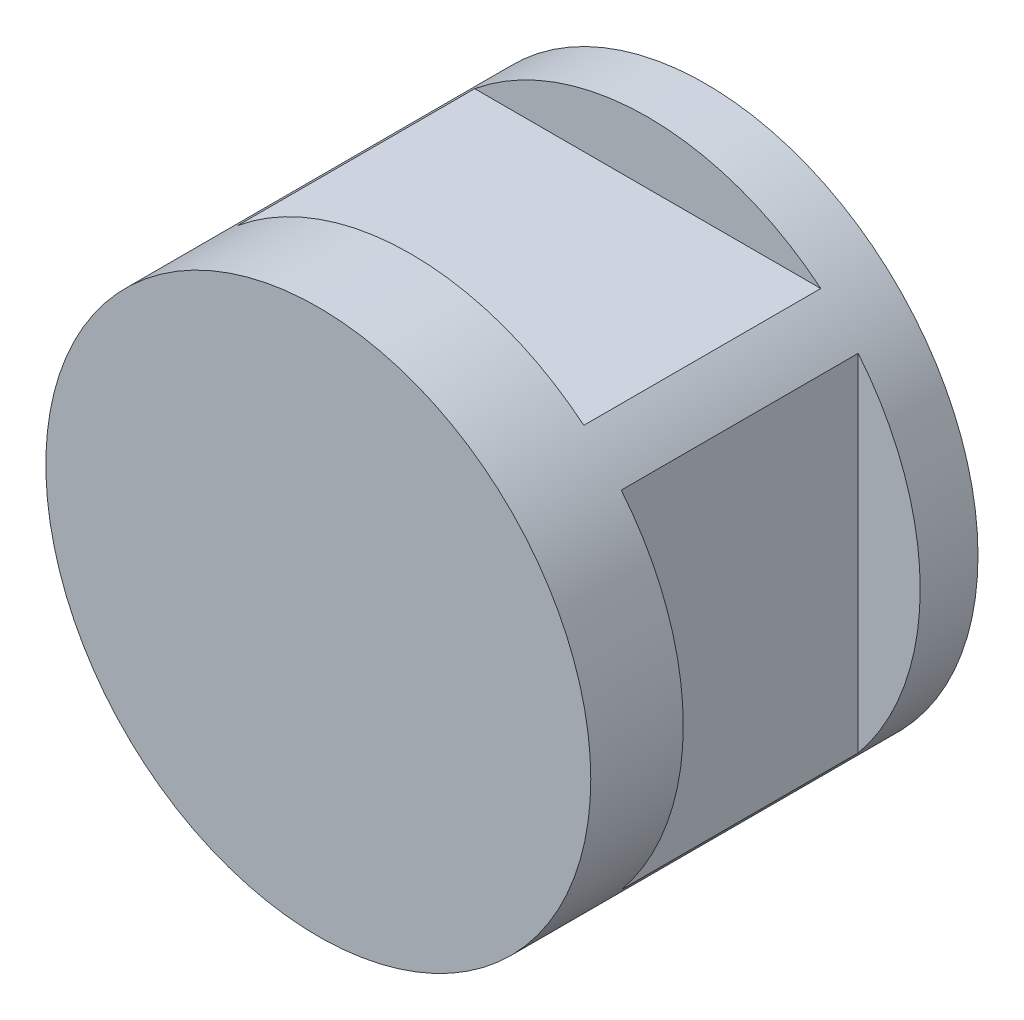
ISO-10303-21;
HEADER;
FILE_DESCRIPTION(('STEP AP214'),'2;1');
FILE_NAME('part.step','',(''),(''),'','','');
FILE_SCHEMA(('AUTOMOTIVE_DESIGN { 1 0 10303 214 1 1 1 1 }'));
ENDSEC;
DATA;
#1=APPLICATION_CONTEXT('core data for automotive mechanical design processes');
#2=APPLICATION_PROTOCOL_DEFINITION('international standard','automotive_design',2000,#1);
#3=PRODUCT_CONTEXT('',#1,'mechanical');
#4=PRODUCT('Part','Part','',(#3));
#5=PRODUCT_RELATED_PRODUCT_CATEGORY('part','',(#4));
#6=PRODUCT_DEFINITION_FORMATION('','',#4);
#7=PRODUCT_DEFINITION_CONTEXT('part definition',#1,'design');
#8=PRODUCT_DEFINITION('design','',#6,#7);
#9=PRODUCT_DEFINITION_SHAPE('','',#8);
#10=(LENGTH_UNIT() NAMED_UNIT(*) SI_UNIT(.MILLI.,.METRE.));
#11=(NAMED_UNIT(*) PLANE_ANGLE_UNIT() SI_UNIT($,.RADIAN.));
#12=(NAMED_UNIT(*) SI_UNIT($,.STERADIAN.) SOLID_ANGLE_UNIT());
#13=UNCERTAINTY_MEASURE_WITH_UNIT(LENGTH_MEASURE(1.E-05),#10,'distance_accuracy_value','');
#14=(GEOMETRIC_REPRESENTATION_CONTEXT(3) GLOBAL_UNCERTAINTY_ASSIGNED_CONTEXT((#13)) GLOBAL_UNIT_ASSIGNED_CONTEXT((#10,
#11,#12)) REPRESENTATION_CONTEXT('',''));
#15=CARTESIAN_POINT('',(0.,0.,0.));
#16=DIRECTION('',(0.,0.,1.));
#17=DIRECTION('',(1.,0.,0.));
#18=AXIS2_PLACEMENT_3D('',#15,#16,#17);
#19=CARTESIAN_POINT('',(0.,0.,-4.064));
#20=DIRECTION('',(0.,0.,1.));
#21=DIRECTION('',(1.,0.,0.));
#22=AXIS2_PLACEMENT_3D('',#19,#20,#21);
#23=PLANE('',#22);
#24=DIRECTION('',(-1.,0.,0.));
#25=VECTOR('',#24,1.);
#26=CARTESIAN_POINT('',(0.,-9.250000032,-4.064));
#27=LINE('',#26,#25);
#28=CARTESIAN_POINT('',(7.60513807727381,-9.250000032,-4.064));
#29=VERTEX_POINT('',#28);
#30=CARTESIAN_POINT('',(-7.60513807727381,-9.250000032,-4.064));
#31=VERTEX_POINT('',#30);
#32=EDGE_CURVE('E63',#29,#31,#27,.T.);
#33=ORIENTED_EDGE('',*,*,#32,.F.);
#34=CARTESIAN_POINT('',(0.,0.,-4.064));
#35=DIRECTION('',(0.,0.,1.));
#36=DIRECTION('',(1.,0.,0.));
#37=AXIS2_PLACEMENT_3D('',#34,#35,#36);
#38=CIRCLE('',#37,11.975000032);
#39=EDGE_CURVE('E167',#31,#29,#38,.T.);
#40=ORIENTED_EDGE('',*,*,#39,.F.);
#41=EDGE_LOOP('',(#33,#40));
#42=FACE_BOUND('',#41,.T.);
#43=ADVANCED_FACE('F41',(#42),#23,.F.);
#44=DIRECTION('',(0.,-1.,0.));
#45=VECTOR('',#44,1.);
#46=CARTESIAN_POINT('',(9.250000032,0.,-4.064));
#47=LINE('',#46,#45);
#48=CARTESIAN_POINT('',(9.250000032,7.60513807727381,-4.064));
#49=VERTEX_POINT('',#48);
#50=CARTESIAN_POINT('',(9.250000032,-7.60513807727381,-4.064));
#51=VERTEX_POINT('',#50);
#52=EDGE_CURVE('E146',#49,#51,#47,.T.);
#53=ORIENTED_EDGE('',*,*,#52,.F.);
#54=EDGE_CURVE('E51',#51,#49,#38,.T.);
#55=ORIENTED_EDGE('',*,*,#54,.F.);
#56=EDGE_LOOP('',(#53,#55));
#57=FACE_BOUND('',#56,.T.);
#58=ADVANCED_FACE('F191',(#57),#23,.F.);
#59=DIRECTION('',(1.,0.,0.));
#60=VECTOR('',#59,1.);
#61=CARTESIAN_POINT('',(0.,9.250000032,-4.064));
#62=LINE('',#61,#60);
#63=CARTESIAN_POINT('',(-7.60513807727381,9.250000032,-4.064));
#64=VERTEX_POINT('',#63);
#65=CARTESIAN_POINT('',(7.60513807727381,9.250000032,-4.064));
#66=VERTEX_POINT('',#65);
#67=EDGE_CURVE('E143',#64,#66,#62,.T.);
#68=ORIENTED_EDGE('',*,*,#67,.F.);
#69=EDGE_CURVE('E11',#66,#64,#38,.T.);
#70=ORIENTED_EDGE('',*,*,#69,.F.);
#71=EDGE_LOOP('',(#68,#70));
#72=FACE_BOUND('',#71,.T.);
#73=ADVANCED_FACE('F189',(#72),#23,.F.);
#74=DIRECTION('',(0.,1.,0.));
#75=VECTOR('',#74,1.);
#76=CARTESIAN_POINT('',(-9.250000032,0.,-4.064));
#77=LINE('',#76,#75);
#78=CARTESIAN_POINT('',(-9.250000032,-7.60513807727381,-4.064));
#79=VERTEX_POINT('',#78);
#80=CARTESIAN_POINT('',(-9.250000032,7.60513807727381,-4.064));
#81=VERTEX_POINT('',#80);
#82=EDGE_CURVE('E140',#79,#81,#77,.T.);
#83=ORIENTED_EDGE('',*,*,#82,.F.);
#84=EDGE_CURVE('E50',#81,#79,#38,.T.);
#85=ORIENTED_EDGE('',*,*,#84,.F.);
#86=EDGE_LOOP('',(#83,#85));
#87=FACE_BOUND('',#86,.T.);
#88=ADVANCED_FACE('F175',(#87),#23,.F.);
#89=CARTESIAN_POINT('',(0.,0.,-4.064));
#90=DIRECTION('',(0.,0.,1.));
#91=DIRECTION('',(1.,0.,0.));
#92=AXIS2_PLACEMENT_3D('',#89,#90,#91);
#93=CYLINDRICAL_SURFACE('',#92,11.975000032);
#94=DIRECTION('',(0.,0.,1.));
#95=VECTOR('',#94,1.);
#96=CARTESIAN_POINT('',(-9.250000032,-7.60513807727381,-14.478));
#97=LINE('',#96,#95);
#98=CARTESIAN_POINT('',(-9.250000032,-7.60513807727381,-14.478));
#99=VERTEX_POINT('',#98);
#100=EDGE_CURVE('E165',#99,#79,#97,.T.);
#101=ORIENTED_EDGE('',*,*,#100,.F.);
#102=CARTESIAN_POINT('',(0.,0.,-14.478));
#103=DIRECTION('',(0.,0.,-1.));
#104=DIRECTION('',(-1.,0.,0.));
#105=AXIS2_PLACEMENT_3D('',#102,#103,#104);
#106=CIRCLE('',#105,11.975000032);
#107=CARTESIAN_POINT('',(-9.250000032,7.60513807727381,-14.478));
#108=VERTEX_POINT('',#107);
#109=EDGE_CURVE('E124',#99,#108,#106,.T.);
#110=ORIENTED_EDGE('',*,*,#109,.T.);
#111=DIRECTION('',(0.,0.,1.));
#112=VECTOR('',#111,1.);
#113=CARTESIAN_POINT('',(-9.250000032,7.60513807727381,-14.478));
#114=LINE('',#113,#112);
#115=EDGE_CURVE('E162',#108,#81,#114,.T.);
#116=ORIENTED_EDGE('',*,*,#115,.T.);
#117=ORIENTED_EDGE('',*,*,#84,.T.);
#118=EDGE_LOOP('',(#101,#110,#116,#117));
#119=FACE_BOUND('',#118,.T.);
#120=DIRECTION('',(0.,0.,1.));
#121=VECTOR('',#120,1.);
#122=CARTESIAN_POINT('',(-7.60513807727381,9.250000032,-14.478));
#123=LINE('',#122,#121);
#124=CARTESIAN_POINT('',(-7.60513807727381,9.250000032,-14.478));
#125=VERTEX_POINT('',#124);
#126=EDGE_CURVE('E159',#125,#64,#123,.T.);
#127=ORIENTED_EDGE('',*,*,#126,.F.);
#128=CARTESIAN_POINT('',(7.60513807727381,9.250000032,-14.478));
#129=VERTEX_POINT('',#128);
#130=EDGE_CURVE('E127',#125,#129,#106,.T.);
#131=ORIENTED_EDGE('',*,*,#130,.T.);
#132=DIRECTION('',(0.,0.,1.));
#133=VECTOR('',#132,1.);
#134=CARTESIAN_POINT('',(7.60513807727381,9.250000032,-14.478));
#135=LINE('',#134,#133);
#136=EDGE_CURVE('E156',#129,#66,#135,.T.);
#137=ORIENTED_EDGE('',*,*,#136,.T.);
#138=ORIENTED_EDGE('',*,*,#69,.T.);
#139=EDGE_LOOP('',(#127,#131,#137,#138));
#140=FACE_BOUND('',#139,.T.);
#141=DIRECTION('',(0.,0.,1.));
#142=VECTOR('',#141,1.);
#143=CARTESIAN_POINT('',(9.250000032,7.60513807727381,-14.478));
#144=LINE('',#143,#142);
#145=CARTESIAN_POINT('',(9.250000032,7.60513807727381,-14.478));
#146=VERTEX_POINT('',#145);
#147=EDGE_CURVE('E153',#146,#49,#144,.T.);
#148=ORIENTED_EDGE('',*,*,#147,.F.);
#149=CARTESIAN_POINT('',(9.250000032,-7.60513807727381,-14.478));
#150=VERTEX_POINT('',#149);
#151=EDGE_CURVE('E123',#146,#150,#106,.T.);
#152=ORIENTED_EDGE('',*,*,#151,.T.);
#153=DIRECTION('',(0.,0.,1.));
#154=VECTOR('',#153,1.);
#155=CARTESIAN_POINT('',(9.250000032,-7.60513807727381,-14.478));
#156=LINE('',#155,#154);
#157=EDGE_CURVE('E150',#150,#51,#156,.T.);
#158=ORIENTED_EDGE('',*,*,#157,.T.);
#159=ORIENTED_EDGE('',*,*,#54,.T.);
#160=EDGE_LOOP('',(#148,#152,#158,#159));
#161=FACE_BOUND('',#160,.T.);
#162=CARTESIAN_POINT('',(7.60513807727381,-9.250000032,-14.478));
#163=VERTEX_POINT('',#162);
#164=CARTESIAN_POINT('',(-7.60513807727381,-9.250000032,-14.478));
#165=VERTEX_POINT('',#164);
#166=EDGE_CURVE('E119',#163,#165,#106,.T.);
#167=ORIENTED_EDGE('',*,*,#166,.T.);
#168=DIRECTION('',(0.,0.,1.));
#169=VECTOR('',#168,1.);
#170=CARTESIAN_POINT('',(-7.60513807727381,-9.250000032,-14.478));
#171=LINE('',#170,#169);
#172=EDGE_CURVE('E107',#165,#31,#171,.T.);
#173=ORIENTED_EDGE('',*,*,#172,.T.);
#174=ORIENTED_EDGE('',*,*,#39,.T.);
#175=DIRECTION('',(0.,0.,1.));
#176=VECTOR('',#175,1.);
#177=CARTESIAN_POINT('',(7.60513807727381,-9.250000032,-14.478));
#178=LINE('',#177,#176);
#179=EDGE_CURVE('E115',#163,#29,#178,.T.);
#180=ORIENTED_EDGE('',*,*,#179,.F.);
#181=EDGE_LOOP('',(#167,#173,#174,#180));
#182=FACE_BOUND('',#181,.T.);
#183=CARTESIAN_POINT('',(0.,0.,0.));
#184=DIRECTION('',(0.,0.,1.));
#185=DIRECTION('',(1.,0.,0.));
#186=AXIS2_PLACEMENT_3D('',#183,#184,#185);
#187=CIRCLE('',#186,11.975000032);
#188=CARTESIAN_POINT('',(11.975000032,0.,0.));
#189=VERTEX_POINT('',#188);
#190=EDGE_CURVE('E45',#189,#189,#187,.T.);
#191=ORIENTED_EDGE('',*,*,#190,.F.);
#192=EDGE_LOOP('',(#191));
#193=FACE_BOUND('',#192,.T.);
#194=CARTESIAN_POINT('',(0.,0.,-17.018));
#195=DIRECTION('',(0.,0.,-1.));
#196=DIRECTION('',(-1.,0.,0.));
#197=AXIS2_PLACEMENT_3D('',#194,#195,#196);
#198=CIRCLE('',#197,11.975000032);
#199=CARTESIAN_POINT('',(-11.975000032,0.,-17.018));
#200=VERTEX_POINT('',#199);
#201=EDGE_CURVE('E131',#200,#200,#198,.T.);
#202=ORIENTED_EDGE('',*,*,#201,.F.);
#203=EDGE_LOOP('',(#202));
#204=FACE_BOUND('',#203,.T.);
#205=ADVANCED_FACE('F43',(#119,#140,#161,#182,#193,#204),#93,.T.);
#206=CARTESIAN_POINT('',(0.,0.,0.));
#207=DIRECTION('',(0.,0.,1.));
#208=DIRECTION('',(1.,0.,0.));
#209=AXIS2_PLACEMENT_3D('',#206,#207,#208);
#210=PLANE('',#209);
#211=ORIENTED_EDGE('',*,*,#190,.T.);
#212=EDGE_LOOP('',(#211));
#213=FACE_BOUND('',#212,.T.);
#214=ADVANCED_FACE('F172',(#213),#210,.T.);
#215=CARTESIAN_POINT('',(-9.250000032,0.,-14.478));
#216=DIRECTION('',(1.,0.,0.));
#217=DIRECTION('',(0.,1.,0.));
#218=AXIS2_PLACEMENT_3D('',#215,#216,#217);
#219=PLANE('',#218);
#220=ORIENTED_EDGE('',*,*,#82,.T.);
#221=ORIENTED_EDGE('',*,*,#115,.F.);
#222=DIRECTION('',(0.,1.,0.));
#223=VECTOR('',#222,1.);
#224=CARTESIAN_POINT('',(-9.250000032,0.,-14.478));
#225=LINE('',#224,#223);
#226=EDGE_CURVE('E132',#99,#108,#225,.T.);
#227=ORIENTED_EDGE('',*,*,#226,.F.);
#228=ORIENTED_EDGE('',*,*,#100,.T.);
#229=EDGE_LOOP('',(#220,#221,#227,#228));
#230=FACE_BOUND('',#229,.T.);
#231=ADVANCED_FACE('F233',(#230),#219,.F.);
#232=CARTESIAN_POINT('',(0.,9.250000032,-14.478));
#233=DIRECTION('',(0.,-1.,0.));
#234=DIRECTION('',(1.,0.,0.));
#235=AXIS2_PLACEMENT_3D('',#232,#233,#234);
#236=PLANE('',#235);
#237=ORIENTED_EDGE('',*,*,#67,.T.);
#238=ORIENTED_EDGE('',*,*,#136,.F.);
#239=DIRECTION('',(1.,0.,0.));
#240=VECTOR('',#239,1.);
#241=CARTESIAN_POINT('',(0.,9.250000032,-14.478));
#242=LINE('',#241,#240);
#243=EDGE_CURVE('E135',#125,#129,#242,.T.);
#244=ORIENTED_EDGE('',*,*,#243,.F.);
#245=ORIENTED_EDGE('',*,*,#126,.T.);
#246=EDGE_LOOP('',(#237,#238,#244,#245));
#247=FACE_BOUND('',#246,.T.);
#248=ADVANCED_FACE('F187',(#247),#236,.F.);
#249=CARTESIAN_POINT('',(9.250000032,0.,-14.478));
#250=DIRECTION('',(-1.,0.,0.));
#251=DIRECTION('',(0.,0.,1.));
#252=AXIS2_PLACEMENT_3D('',#249,#250,#251);
#253=PLANE('',#252);
#254=ORIENTED_EDGE('',*,*,#52,.T.);
#255=ORIENTED_EDGE('',*,*,#157,.F.);
#256=DIRECTION('',(0.,-1.,0.));
#257=VECTOR('',#256,1.);
#258=CARTESIAN_POINT('',(9.250000032,0.,-14.478));
#259=LINE('',#258,#257);
#260=EDGE_CURVE('E120',#146,#150,#259,.T.);
#261=ORIENTED_EDGE('',*,*,#260,.F.);
#262=ORIENTED_EDGE('',*,*,#147,.T.);
#263=EDGE_LOOP('',(#254,#255,#261,#262));
#264=FACE_BOUND('',#263,.T.);
#265=ADVANCED_FACE('F247',(#264),#253,.F.);
#266=CARTESIAN_POINT('',(0.,-9.250000032,-14.478));
#267=DIRECTION('',(0.,1.,0.));
#268=DIRECTION('',(0.,0.,1.));
#269=AXIS2_PLACEMENT_3D('',#266,#267,#268);
#270=PLANE('',#269);
#271=ORIENTED_EDGE('',*,*,#32,.T.);
#272=ORIENTED_EDGE('',*,*,#172,.F.);
#273=DIRECTION('',(-1.,0.,0.));
#274=VECTOR('',#273,1.);
#275=CARTESIAN_POINT('',(0.,-9.250000032,-14.478));
#276=LINE('',#275,#274);
#277=EDGE_CURVE('E111',#163,#165,#276,.T.);
#278=ORIENTED_EDGE('',*,*,#277,.F.);
#279=ORIENTED_EDGE('',*,*,#179,.T.);
#280=EDGE_LOOP('',(#271,#272,#278,#279));
#281=FACE_BOUND('',#280,.T.);
#282=ADVANCED_FACE('F109',(#281),#270,.F.);
#283=CARTESIAN_POINT('',(0.,0.,-14.478));
#284=DIRECTION('',(0.,0.,-1.));
#285=DIRECTION('',(-1.,0.,0.));
#286=AXIS2_PLACEMENT_3D('',#283,#284,#285);
#287=PLANE('',#286);
#288=ORIENTED_EDGE('',*,*,#109,.F.);
#289=ORIENTED_EDGE('',*,*,#226,.T.);
#290=EDGE_LOOP('',(#288,#289));
#291=FACE_BOUND('',#290,.T.);
#292=ADVANCED_FACE('F266',(#291),#287,.F.);
#293=ORIENTED_EDGE('',*,*,#130,.F.);
#294=ORIENTED_EDGE('',*,*,#243,.T.);
#295=EDGE_LOOP('',(#293,#294));
#296=FACE_BOUND('',#295,.T.);
#297=ADVANCED_FACE('F185',(#296),#287,.F.);
#298=ORIENTED_EDGE('',*,*,#151,.F.);
#299=ORIENTED_EDGE('',*,*,#260,.T.);
#300=EDGE_LOOP('',(#298,#299));
#301=FACE_BOUND('',#300,.T.);
#302=ADVANCED_FACE('F285',(#301),#287,.F.);
#303=ORIENTED_EDGE('',*,*,#166,.F.);
#304=ORIENTED_EDGE('',*,*,#277,.T.);
#305=EDGE_LOOP('',(#303,#304));
#306=FACE_BOUND('',#305,.T.);
#307=ADVANCED_FACE('F118',(#306),#287,.F.);
#308=CARTESIAN_POINT('',(0.,0.,-17.018));
#309=DIRECTION('',(0.,0.,-1.));
#310=DIRECTION('',(-1.,0.,0.));
#311=AXIS2_PLACEMENT_3D('',#308,#309,#310);
#312=PLANE('',#311);
#313=ORIENTED_EDGE('',*,*,#201,.T.);
#314=EDGE_LOOP('',(#313));
#315=FACE_BOUND('',#314,.T.);
#316=ADVANCED_FACE('F303',(#315),#312,.T.);
#317=CLOSED_SHELL('',(#43,#58,#73,#88,#205,#214,#231,#248,#265,#282,#292,#297,#302,#307,#316));
#318=MANIFOLD_SOLID_BREP('B2',#317);
#319=ADVANCED_BREP_SHAPE_REPRESENTATION('',(#18,#318),#14);
#320=SHAPE_DEFINITION_REPRESENTATION(#9,#319);
ENDSEC;
END-ISO-10303-21;
